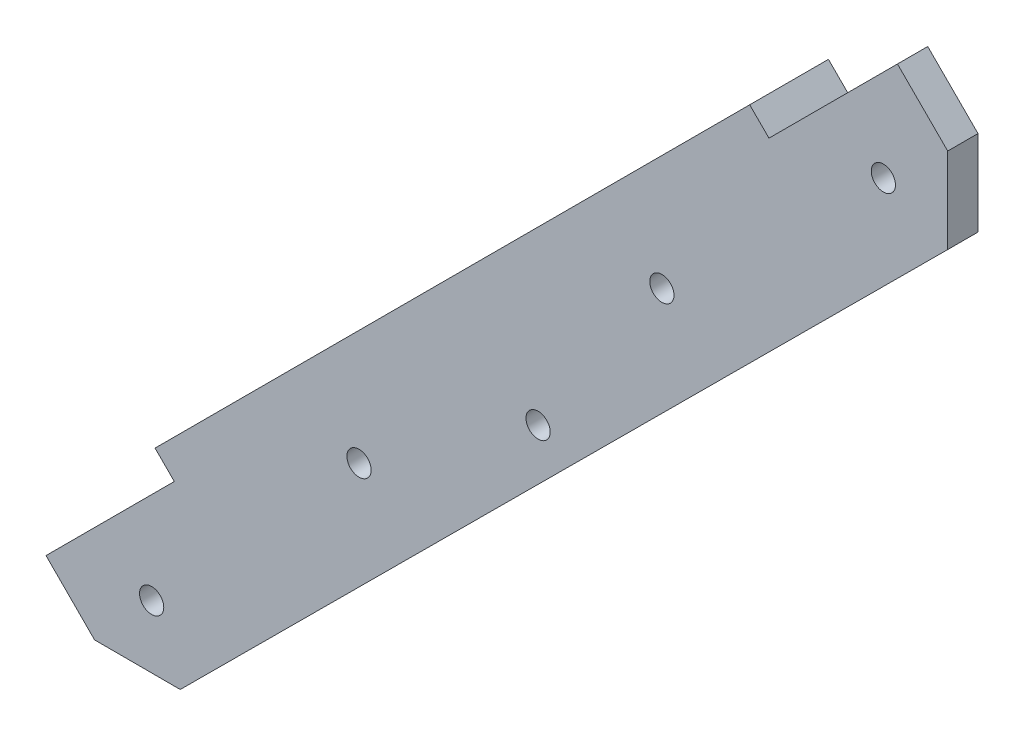
ISO-10303-21;
HEADER;
FILE_DESCRIPTION(('STEP AP214'),'2;1');
FILE_NAME('part.step','',(''),(''),'','','');
FILE_SCHEMA(('AUTOMOTIVE_DESIGN { 1 0 10303 214 1 1 1 1 }'));
ENDSEC;
DATA;
#1=APPLICATION_CONTEXT('core data for automotive mechanical design processes');
#2=APPLICATION_PROTOCOL_DEFINITION('international standard','automotive_design',2000,#1);
#3=PRODUCT_CONTEXT('',#1,'mechanical');
#4=PRODUCT('Part','Part','',(#3));
#5=PRODUCT_RELATED_PRODUCT_CATEGORY('part','',(#4));
#6=PRODUCT_DEFINITION_FORMATION('','',#4);
#7=PRODUCT_DEFINITION_CONTEXT('part definition',#1,'design');
#8=PRODUCT_DEFINITION('design','',#6,#7);
#9=PRODUCT_DEFINITION_SHAPE('','',#8);
#10=(LENGTH_UNIT() NAMED_UNIT(*) SI_UNIT(.MILLI.,.METRE.));
#11=(NAMED_UNIT(*) PLANE_ANGLE_UNIT() SI_UNIT($,.RADIAN.));
#12=(NAMED_UNIT(*) SI_UNIT($,.STERADIAN.) SOLID_ANGLE_UNIT());
#13=UNCERTAINTY_MEASURE_WITH_UNIT(LENGTH_MEASURE(1.E-05),#10,'distance_accuracy_value','');
#14=(GEOMETRIC_REPRESENTATION_CONTEXT(3) GLOBAL_UNCERTAINTY_ASSIGNED_CONTEXT((#13)) GLOBAL_UNIT_ASSIGNED_CONTEXT((#10,
#11,#12)) REPRESENTATION_CONTEXT('',''));
#15=CARTESIAN_POINT('',(0.,0.,0.));
#16=DIRECTION('',(0.,0.,1.));
#17=DIRECTION('',(1.,0.,0.));
#18=AXIS2_PLACEMENT_3D('',#15,#16,#17);
#19=CARTESIAN_POINT('',(111.999999999999,110.,-8.00100000000389));
#20=DIRECTION('',(0.,0.,1.));
#21=DIRECTION('',(1.,0.,0.));
#22=AXIS2_PLACEMENT_3D('',#19,#20,#21);
#23=CYLINDRICAL_SURFACE('',#22,1.99999999999992);
#24=CARTESIAN_POINT('',(111.999999999999,110.,5.));
#25=DIRECTION('',(0.,0.,1.));
#26=DIRECTION('',(1.,0.,0.));
#27=AXIS2_PLACEMENT_3D('',#24,#25,#26);
#28=CIRCLE('',#27,1.99999999999992);
#29=CARTESIAN_POINT('',(113.999999999999,110.,5.));
#30=VERTEX_POINT('',#29);
#31=EDGE_CURVE('E219',#30,#30,#28,.T.);
#32=ORIENTED_EDGE('',*,*,#31,.T.);
#33=EDGE_LOOP('',(#32));
#34=FACE_BOUND('',#33,.T.);
#35=CARTESIAN_POINT('',(111.999999999999,110.,-5.00000000000385));
#36=DIRECTION('',(0.,0.,-1.));
#37=DIRECTION('',(0.,1.,0.));
#38=AXIS2_PLACEMENT_3D('',#35,#36,#37);
#39=CIRCLE('',#38,1.99999999999992);
#40=CARTESIAN_POINT('',(111.999999999999,112.,-5.00000000000385));
#41=VERTEX_POINT('',#40);
#42=EDGE_CURVE('E222',#41,#41,#39,.F.);
#43=ORIENTED_EDGE('',*,*,#42,.F.);
#44=EDGE_LOOP('',(#43));
#45=FACE_BOUND('',#44,.T.);
#46=ADVANCED_FACE('F34',(#34,#45),#23,.F.);
#47=CARTESIAN_POINT('',(61.9999999999991,60.0000000000004,-8.00100000000389));
#48=DIRECTION('',(0.,0.,1.));
#49=DIRECTION('',(1.,0.,0.));
#50=AXIS2_PLACEMENT_3D('',#47,#48,#49);
#51=CYLINDRICAL_SURFACE('',#50,1.99999999999989);
#52=CARTESIAN_POINT('',(61.9999999999991,60.0000000000004,5.));
#53=DIRECTION('',(0.,0.,1.));
#54=DIRECTION('',(1.,0.,0.));
#55=AXIS2_PLACEMENT_3D('',#52,#53,#54);
#56=CIRCLE('',#55,1.99999999999989);
#57=CARTESIAN_POINT('',(63.999999999999,60.0000000000004,5.));
#58=VERTEX_POINT('',#57);
#59=EDGE_CURVE('E215',#58,#58,#56,.T.);
#60=ORIENTED_EDGE('',*,*,#59,.T.);
#61=EDGE_LOOP('',(#60));
#62=FACE_BOUND('',#61,.T.);
#63=CARTESIAN_POINT('',(61.9999999999991,60.0000000000004,-5.00000000000388));
#64=DIRECTION('',(0.,0.,-1.));
#65=DIRECTION('',(0.,1.,0.));
#66=AXIS2_PLACEMENT_3D('',#63,#64,#65);
#67=CIRCLE('',#66,1.99999999999989);
#68=CARTESIAN_POINT('',(61.9999999999991,62.0000000000003,-5.00000000000388));
#69=VERTEX_POINT('',#68);
#70=EDGE_CURVE('E206',#69,#69,#67,.F.);
#71=ORIENTED_EDGE('',*,*,#70,.F.);
#72=EDGE_LOOP('',(#71));
#73=FACE_BOUND('',#72,.T.);
#74=ADVANCED_FACE('F374',(#62,#73),#51,.F.);
#75=CARTESIAN_POINT('',(0.,0.,0.));
#76=DIRECTION('',(0.,0.,-1.));
#77=DIRECTION('',(-1.,0.,0.));
#78=AXIS2_PLACEMENT_3D('',#75,#76,#77);
#79=PLANE('',#78);
#80=DIRECTION('',(0.708378811392067,0.705832458569852,0.));
#81=VECTOR('',#80,1.);
#82=CARTESIAN_POINT('',(144.999999999996,125.000009715621,0.));
#83=LINE('',#82,#81);
#84=CARTESIAN_POINT('',(32.4788703815637,12.8833508286033,0.));
#85=VERTEX_POINT('',#84);
#86=CARTESIAN_POINT('',(46.6133955019609,26.9670676987364,0.));
#87=VERTEX_POINT('',#86);
#88=EDGE_CURVE('E280',#85,#87,#83,.T.);
#89=ORIENTED_EDGE('',*,*,#88,.F.);
#90=DIRECTION('',(0.999998379020512,-0.0018005433478821,0.));
#91=VECTOR('',#90,1.);
#92=CARTESIAN_POINT('',(0.023302289110957,12.9417885805603,0.));
#93=LINE('',#92,#91);
#94=CARTESIAN_POINT('',(18.3367576819445,12.9088143568254,0.));
#95=VERTEX_POINT('',#94);
#96=EDGE_CURVE('E58',#85,#95,#93,.F.);
#97=ORIENTED_EDGE('',*,*,#96,.T.);
#98=DIRECTION('',(0.705832458569853,-0.708378811392066,0.));
#99=VECTOR('',#98,1.);
#100=CARTESIAN_POINT('',(25.3950822676431,5.82502624290472,0.));
#101=LINE('',#100,#99);
#102=CARTESIAN_POINT('',(10.3192285063964,20.9552674757194,0.));
#103=VERTEX_POINT('',#102);
#104=EDGE_CURVE('E264',#103,#95,#101,.T.);
#105=ORIENTED_EDGE('',*,*,#104,.F.);
#106=DIRECTION('',(-0.707106781186551,-0.707106781186544,0.));
#107=VECTOR('',#106,1.);
#108=CARTESIAN_POINT('',(31.5052038200413,42.1412427893641,0.));
#109=LINE('',#108,#107);
#110=CARTESIAN_POINT('',(31.4994745169042,42.1355134862271,0.));
#111=VERTEX_POINT('',#110);
#112=EDGE_CURVE('E290',#111,#103,#109,.T.);
#113=ORIENTED_EDGE('',*,*,#112,.F.);
#114=DIRECTION('',(-0.705832458569853,0.708378811392066,0.));
#115=VECTOR('',#114,1.);
#116=CARTESIAN_POINT('',(28.3232233047018,45.3232233047036,0.));
#117=LINE('',#116,#115);
#118=EDGE_CURVE('E239',#87,#111,#117,.T.);
#119=ORIENTED_EDGE('',*,*,#118,.F.);
#120=EDGE_LOOP('',(#89,#97,#105,#113,#119));
#121=FACE_BOUND('',#120,.T.);
#122=CARTESIAN_POINT('',(27.7621167157391,23.2569128956978,0.));
#123=DIRECTION('',(0.,0.,-1.));
#124=DIRECTION('',(-1.,0.,0.));
#125=AXIS2_PLACEMENT_3D('',#122,#123,#124);
#126=CIRCLE('',#125,2.);
#127=CARTESIAN_POINT('',(25.7621167157391,23.2569128956978,0.));
#128=VERTEX_POINT('',#127);
#129=EDGE_CURVE('E311',#128,#128,#126,.T.);
#130=ORIENTED_EDGE('',*,*,#129,.F.);
#131=EDGE_LOOP('',(#130));
#132=FACE_BOUND('',#131,.T.);
#133=ADVANCED_FACE('F380',(#121,#132),#79,.T.);
#134=CARTESIAN_POINT('',(144.999999999996,125.000009715621,5.));
#135=DIRECTION('',(-0.705832458569852,0.708378811392067,0.));
#136=DIRECTION('',(-0.708378811392067,-0.705832458569852,0.));
#137=AXIS2_PLACEMENT_3D('',#134,#135,#136);
#138=PLANE('',#137);
#139=DIRECTION('',(0.708378811392067,0.705832458569853,0.));
#140=VECTOR('',#139,1.);
#141=CARTESIAN_POINT('',(46.6133955019609,26.9670676987363,-8.00000000000389));
#142=LINE('',#141,#140);
#143=CARTESIAN_POINT('',(46.6133955019609,26.9670676987363,-8.00000000000389));
#144=VERTEX_POINT('',#143);
#145=CARTESIAN_POINT('',(86.0012902722658,66.2133779447775,-8.00000000000387));
#146=VERTEX_POINT('',#145);
#147=EDGE_CURVE('E223',#144,#146,#142,.T.);
#148=ORIENTED_EDGE('',*,*,#147,.T.);
#149=DIRECTION('',(0.,0.,1.));
#150=VECTOR('',#149,1.);
#151=CARTESIAN_POINT('',(86.0012902722658,66.2133779447776,4.99999999999997));
#152=LINE('',#151,#150);
#153=CARTESIAN_POINT('',(86.0012902722658,66.2133779447775,-1.00000000000387));
#154=VERTEX_POINT('',#153);
#155=EDGE_CURVE('E199',#146,#154,#152,.T.);
#156=ORIENTED_EDGE('',*,*,#155,.T.);
#157=DIRECTION('',(-0.708378811392067,-0.705832458569852,0.));
#158=VECTOR('',#157,1.);
#159=CARTESIAN_POINT('',(144.999999999996,125.000009715621,-1.00000000000384));
#160=LINE('',#159,#158);
#161=CARTESIAN_POINT('',(105.612105229692,85.7536994695806,-1.00000000000386));
#162=VERTEX_POINT('',#161);
#163=EDGE_CURVE('E11',#162,#154,#160,.T.);
#164=ORIENTED_EDGE('',*,*,#163,.F.);
#165=DIRECTION('',(0.,0.,-1.));
#166=VECTOR('',#165,1.);
#167=CARTESIAN_POINT('',(105.612105229692,85.7536994695806,4.99999999999998));
#168=LINE('',#167,#166);
#169=CARTESIAN_POINT('',(105.612105229692,85.7536994695806,-8.00000000000386));
#170=VERTEX_POINT('',#169);
#171=EDGE_CURVE('E195',#162,#170,#168,.T.);
#172=ORIENTED_EDGE('',*,*,#171,.T.);
#173=CARTESIAN_POINT('',(144.999999999997,125.000009715622,-8.00000000000384));
#174=VERTEX_POINT('',#173);
#175=EDGE_CURVE('E227',#170,#174,#142,.T.);
#176=ORIENTED_EDGE('',*,*,#175,.T.);
#177=DIRECTION('',(0.,0.,1.));
#178=VECTOR('',#177,1.);
#179=CARTESIAN_POINT('',(144.999999999997,125.000009715622,-172.904201471418));
#180=LINE('',#179,#178);
#181=CARTESIAN_POINT('',(144.999999999997,125.000009715622,0.));
#182=VERTEX_POINT('',#181);
#183=EDGE_CURVE('E248',#174,#182,#180,.T.);
#184=ORIENTED_EDGE('',*,*,#183,.T.);
#185=CARTESIAN_POINT('',(159.167576227838,139.116658887018,0.));
#186=VERTEX_POINT('',#185);
#187=EDGE_CURVE('E283',#182,#186,#83,.T.);
#188=ORIENTED_EDGE('',*,*,#187,.T.);
#189=DIRECTION('',(0.,0.,1.));
#190=VECTOR('',#189,1.);
#191=CARTESIAN_POINT('',(159.167576227838,139.116658887018,5.));
#192=LINE('',#191,#190);
#193=CARTESIAN_POINT('',(159.167576227837,139.116658887018,5.));
#194=VERTEX_POINT('',#193);
#195=EDGE_CURVE('E321',#186,#194,#192,.T.);
#196=ORIENTED_EDGE('',*,*,#195,.T.);
#197=DIRECTION('',(0.708378811392066,0.705832458569853,0.));
#198=VECTOR('',#197,1.);
#199=CARTESIAN_POINT('',(46.6464466094051,27.0000000000003,5.));
#200=LINE('',#199,#198);
#201=CARTESIAN_POINT('',(32.4788703815637,12.8833508286032,5.));
#202=VERTEX_POINT('',#201);
#203=EDGE_CURVE('E260',#202,#194,#200,.T.);
#204=ORIENTED_EDGE('',*,*,#203,.F.);
#205=DIRECTION('',(0.,0.,-1.));
#206=VECTOR('',#205,1.);
#207=CARTESIAN_POINT('',(32.4788703815637,12.8833508286033,5.));
#208=LINE('',#207,#206);
#209=EDGE_CURVE('E318',#202,#85,#208,.T.);
#210=ORIENTED_EDGE('',*,*,#209,.T.);
#211=ORIENTED_EDGE('',*,*,#88,.T.);
#212=DIRECTION('',(0.,0.,1.));
#213=VECTOR('',#212,1.);
#214=CARTESIAN_POINT('',(46.6133955019609,26.9670676987363,-172.904201471418));
#215=LINE('',#214,#213);
#216=EDGE_CURVE('E245',#144,#87,#215,.T.);
#217=ORIENTED_EDGE('',*,*,#216,.F.);
#218=EDGE_LOOP('',(#148,#156,#164,#172,#176,#184,#188,#196,#204,#210,#211,#217));
#219=FACE_BOUND('',#218,.T.);
#220=ADVANCED_FACE('F339',(#219),#138,.F.);
#221=CARTESIAN_POINT('',(166.251364341758,146.174983472716,5.));
#222=DIRECTION('',(-0.707106781186548,-0.707106781186547,0.));
#223=DIRECTION('',(0.707106781186547,-0.707106781186548,0.));
#224=AXIS2_PLACEMENT_3D('',#221,#222,#223);
#225=PLANE('',#224);
#226=DIRECTION('',(-0.707106781186547,0.707106781186548,0.));
#227=VECTOR('',#226,1.);
#228=CARTESIAN_POINT('',(166.251364341758,146.174983472716,5.));
#229=LINE('',#228,#227);
#230=CARTESIAN_POINT('',(159.192993990203,153.233353824272,5.));
#231=VERTEX_POINT('',#230);
#232=CARTESIAN_POINT('',(150.895154422576,161.531193391899,5.));
#233=VERTEX_POINT('',#232);
#234=EDGE_CURVE('E263',#231,#233,#229,.T.);
#235=ORIENTED_EDGE('',*,*,#234,.F.);
#236=DIRECTION('',(0.,0.,-1.));
#237=VECTOR('',#236,1.);
#238=CARTESIAN_POINT('',(159.192993990203,153.233353824272,5.));
#239=LINE('',#238,#237);
#240=CARTESIAN_POINT('',(159.192993990203,153.233353824272,0.));
#241=VERTEX_POINT('',#240);
#242=EDGE_CURVE('E237',#231,#241,#239,.T.);
#243=ORIENTED_EDGE('',*,*,#242,.T.);
#244=DIRECTION('',(-0.707106781186547,0.707106781186548,0.));
#245=VECTOR('',#244,1.);
#246=CARTESIAN_POINT('',(166.251364341758,146.174983472716,0.));
#247=LINE('',#246,#245);
#248=CARTESIAN_POINT('',(150.895154422576,161.531193391899,0.));
#249=VERTEX_POINT('',#248);
#250=EDGE_CURVE('E282',#241,#249,#247,.T.);
#251=ORIENTED_EDGE('',*,*,#250,.T.);
#252=DIRECTION('',(0.,0.,-1.));
#253=VECTOR('',#252,1.);
#254=CARTESIAN_POINT('',(150.895154422576,161.531193391899,5.));
#255=LINE('',#254,#253);
#256=EDGE_CURVE('E238',#233,#249,#255,.T.);
#257=ORIENTED_EDGE('',*,*,#256,.F.);
#258=EDGE_LOOP('',(#235,#243,#251,#257));
#259=FACE_BOUND('',#258,.T.);
#260=ADVANCED_FACE('F431',(#259),#225,.F.);
#261=CARTESIAN_POINT('',(150.895154422576,161.531193391899,5.));
#262=DIRECTION('',(0.7071067811865,-0.707106781186595,0.));
#263=DIRECTION('',(0.707106781186595,0.7071067811865,0.));
#264=AXIS2_PLACEMENT_3D('',#261,#262,#263);
#265=PLANE('',#264);
#266=DIRECTION('',(-0.707106781186595,-0.7071067811865,0.));
#267=VECTOR('',#266,1.);
#268=CARTESIAN_POINT('',(150.895154422576,161.531193391899,0.));
#269=LINE('',#268,#267);
#270=CARTESIAN_POINT('',(129.681985373146,140.318024342472,0.));
#271=VERTEX_POINT('',#270);
#272=EDGE_CURVE('E285',#249,#271,#269,.T.);
#273=ORIENTED_EDGE('',*,*,#272,.T.);
#274=DIRECTION('',(0.,0.,-1.));
#275=VECTOR('',#274,1.);
#276=CARTESIAN_POINT('',(129.681985373146,140.318024342472,5.));
#277=LINE('',#276,#275);
#278=CARTESIAN_POINT('',(129.681985373146,140.318024342472,5.));
#279=VERTEX_POINT('',#278);
#280=EDGE_CURVE('E304',#279,#271,#277,.T.);
#281=ORIENTED_EDGE('',*,*,#280,.F.);
#282=DIRECTION('',(-0.707106781186595,-0.7071067811865,0.));
#283=VECTOR('',#282,1.);
#284=CARTESIAN_POINT('',(150.895154422576,161.531193391899,5.));
#285=LINE('',#284,#283);
#286=EDGE_CURVE('E266',#233,#279,#285,.T.);
#287=ORIENTED_EDGE('',*,*,#286,.F.);
#288=ORIENTED_EDGE('',*,*,#256,.T.);
#289=EDGE_LOOP('',(#273,#281,#287,#288));
#290=FACE_BOUND('',#289,.T.);
#291=ADVANCED_FACE('F428',(#290),#265,.F.);
#292=CARTESIAN_POINT('',(129.681985373146,140.318024342472,5.));
#293=DIRECTION('',(-0.707106781186588,-0.707106781186507,0.));
#294=DIRECTION('',(0.707106781186507,-0.707106781186588,0.));
#295=AXIS2_PLACEMENT_3D('',#292,#293,#294);
#296=PLANE('',#295);
#297=ORIENTED_EDGE('',*,*,#280,.T.);
#298=DIRECTION('',(0.707106781186548,-0.707106781186547,0.));
#299=VECTOR('',#298,1.);
#300=CARTESIAN_POINT('',(144.999999999997,125.000009715622,0.));
#301=LINE('',#300,#299);
#302=EDGE_CURVE('E234',#271,#182,#301,.T.);
#303=ORIENTED_EDGE('',*,*,#302,.T.);
#304=ORIENTED_EDGE('',*,*,#183,.F.);
#305=DIRECTION('',(-0.707106781186548,0.707106781186547,0.));
#306=VECTOR('',#305,1.);
#307=CARTESIAN_POINT('',(144.999999999997,125.000009715622,-8.00000000000384));
#308=LINE('',#307,#306);
#309=CARTESIAN_POINT('',(126.500004857807,143.500004857812,-8.00000000000384));
#310=VERTEX_POINT('',#309);
#311=EDGE_CURVE('E226',#174,#310,#308,.T.);
#312=ORIENTED_EDGE('',*,*,#311,.T.);
#313=DIRECTION('',(0.,0.,-1.));
#314=VECTOR('',#313,1.);
#315=CARTESIAN_POINT('',(126.500004857807,143.500004857812,5.));
#316=LINE('',#315,#314);
#317=CARTESIAN_POINT('',(126.500004857807,143.500004857812,5.));
#318=VERTEX_POINT('',#317);
#319=EDGE_CURVE('E302',#318,#310,#316,.T.);
#320=ORIENTED_EDGE('',*,*,#319,.F.);
#321=DIRECTION('',(-0.707106781186507,0.707106781186588,0.));
#322=VECTOR('',#321,1.);
#323=CARTESIAN_POINT('',(129.681985373146,140.318024342472,5.));
#324=LINE('',#323,#322);
#325=EDGE_CURVE('E268',#279,#318,#324,.T.);
#326=ORIENTED_EDGE('',*,*,#325,.F.);
#327=EDGE_LOOP('',(#297,#303,#304,#312,#320,#326));
#328=FACE_BOUND('',#327,.T.);
#329=ADVANCED_FACE('F355',(#328),#296,.F.);
#330=CARTESIAN_POINT('',(126.500004857807,143.500004857812,5.));
#331=DIRECTION('',(0.707106781186559,-0.707106781186536,0.));
#332=DIRECTION('',(0.707106781186536,0.707106781186559,0.));
#333=AXIS2_PLACEMENT_3D('',#330,#331,#332);
#334=PLANE('',#333);
#335=ORIENTED_EDGE('',*,*,#319,.T.);
#336=DIRECTION('',(-0.707106781186536,-0.707106781186559,0.));
#337=VECTOR('',#336,1.);
#338=CARTESIAN_POINT('',(126.500004857807,143.500004857812,-8.00000000000384));
#339=LINE('',#338,#337);
#340=CARTESIAN_POINT('',(28.3232233047018,45.3232233047036,-8.00000000000389));
#341=VERTEX_POINT('',#340);
#342=EDGE_CURVE('E230',#310,#341,#339,.T.);
#343=ORIENTED_EDGE('',*,*,#342,.T.);
#344=DIRECTION('',(0.,0.,1.));
#345=VECTOR('',#344,1.);
#346=CARTESIAN_POINT('',(28.3232233047018,45.3232233047036,-172.904201471418));
#347=LINE('',#346,#345);
#348=CARTESIAN_POINT('',(28.3232233047018,45.3232233047036,0.));
#349=VERTEX_POINT('',#348);
#350=EDGE_CURVE('E242',#341,#349,#347,.T.);
#351=ORIENTED_EDGE('',*,*,#350,.T.);
#352=DIRECTION('',(0.,0.,-1.));
#353=VECTOR('',#352,1.);
#354=CARTESIAN_POINT('',(28.3232233047018,45.3232233047036,5.));
#355=LINE('',#354,#353);
#356=CARTESIAN_POINT('',(28.3232233047018,45.3232233047036,5.));
#357=VERTEX_POINT('',#356);
#358=EDGE_CURVE('E300',#357,#349,#355,.T.);
#359=ORIENTED_EDGE('',*,*,#358,.F.);
#360=DIRECTION('',(-0.707106781186536,-0.707106781186559,0.));
#361=VECTOR('',#360,1.);
#362=CARTESIAN_POINT('',(126.500004857807,143.500004857812,5.));
#363=LINE('',#362,#361);
#364=EDGE_CURVE('E270',#318,#357,#363,.T.);
#365=ORIENTED_EDGE('',*,*,#364,.F.);
#366=EDGE_LOOP('',(#335,#343,#351,#359,#365));
#367=FACE_BOUND('',#366,.T.);
#368=ADVANCED_FACE('F349',(#367),#334,.F.);
#369=CARTESIAN_POINT('',(28.3232233047018,45.3232233047036,5.));
#370=DIRECTION('',(0.707106781186548,0.707106781186547,0.));
#371=DIRECTION('',(-0.707106781186547,0.707106781186548,0.));
#372=AXIS2_PLACEMENT_3D('',#369,#370,#371);
#373=PLANE('',#372);
#374=DIRECTION('',(0.707106781186547,-0.707106781186548,0.));
#375=VECTOR('',#374,1.);
#376=CARTESIAN_POINT('',(28.3232233047018,45.3232233047036,0.));
#377=LINE('',#376,#375);
#378=CARTESIAN_POINT('',(31.5052038200413,42.1412427893641,0.));
#379=VERTEX_POINT('',#378);
#380=EDGE_CURVE('E288',#349,#379,#377,.T.);
#381=ORIENTED_EDGE('',*,*,#380,.T.);
#382=DIRECTION('',(0.,0.,-1.));
#383=VECTOR('',#382,1.);
#384=CARTESIAN_POINT('',(31.5052038200413,42.1412427893641,5.));
#385=LINE('',#384,#383);
#386=CARTESIAN_POINT('',(31.5052038200413,42.1412427893641,5.));
#387=VERTEX_POINT('',#386);
#388=EDGE_CURVE('E297',#387,#379,#385,.T.);
#389=ORIENTED_EDGE('',*,*,#388,.F.);
#390=DIRECTION('',(0.707106781186547,-0.707106781186548,0.));
#391=VECTOR('',#390,1.);
#392=CARTESIAN_POINT('',(28.3232233047018,45.3232233047036,5.));
#393=LINE('',#392,#391);
#394=EDGE_CURVE('E272',#357,#387,#393,.T.);
#395=ORIENTED_EDGE('',*,*,#394,.F.);
#396=ORIENTED_EDGE('',*,*,#358,.T.);
#397=EDGE_LOOP('',(#381,#389,#395,#396));
#398=FACE_BOUND('',#397,.T.);
#399=ADVANCED_FACE('F419',(#398),#373,.F.);
#400=CARTESIAN_POINT('',(31.5052038200413,42.1412427893641,5.));
#401=DIRECTION('',(0.707106781186544,-0.707106781186551,0.));
#402=DIRECTION('',(0.707106781186551,0.707106781186544,0.));
#403=AXIS2_PLACEMENT_3D('',#400,#401,#402);
#404=PLANE('',#403);
#405=EDGE_CURVE('E291',#379,#111,#109,.T.);
#406=ORIENTED_EDGE('',*,*,#405,.T.);
#407=ORIENTED_EDGE('',*,*,#112,.T.);
#408=DIRECTION('',(0.,0.,-1.));
#409=VECTOR('',#408,1.);
#410=CARTESIAN_POINT('',(10.3192285063964,20.9552674757194,5.));
#411=LINE('',#410,#409);
#412=CARTESIAN_POINT('',(10.3192285063964,20.9552674757194,5.));
#413=VERTEX_POINT('',#412);
#414=EDGE_CURVE('E279',#413,#103,#411,.T.);
#415=ORIENTED_EDGE('',*,*,#414,.F.);
#416=DIRECTION('',(-0.707106781186551,-0.707106781186544,0.));
#417=VECTOR('',#416,1.);
#418=CARTESIAN_POINT('',(31.5052038200413,42.1412427893641,5.));
#419=LINE('',#418,#417);
#420=EDGE_CURVE('E274',#387,#413,#419,.T.);
#421=ORIENTED_EDGE('',*,*,#420,.F.);
#422=ORIENTED_EDGE('',*,*,#388,.T.);
#423=EDGE_LOOP('',(#406,#407,#415,#421,#422));
#424=FACE_BOUND('',#423,.T.);
#425=ADVANCED_FACE('F415',(#424),#404,.F.);
#426=CARTESIAN_POINT('',(25.3950822676431,5.82502624290472,5.));
#427=DIRECTION('',(0.708378811392066,0.705832458569853,0.));
#428=DIRECTION('',(-0.705832458569853,0.708378811392066,0.));
#429=AXIS2_PLACEMENT_3D('',#426,#427,#428);
#430=PLANE('',#429);
#431=ORIENTED_EDGE('',*,*,#104,.T.);
#432=DIRECTION('',(0.,0.,1.));
#433=VECTOR('',#432,1.);
#434=CARTESIAN_POINT('',(18.3367576819445,12.9088143568254,5.));
#435=LINE('',#434,#433);
#436=CARTESIAN_POINT('',(18.3367576819445,12.9088143568254,5.));
#437=VERTEX_POINT('',#436);
#438=EDGE_CURVE('E328',#95,#437,#435,.T.);
#439=ORIENTED_EDGE('',*,*,#438,.T.);
#440=DIRECTION('',(0.705832458569853,-0.708378811392066,0.));
#441=VECTOR('',#440,1.);
#442=CARTESIAN_POINT('',(25.3950822676431,5.82502624290472,5.));
#443=LINE('',#442,#441);
#444=EDGE_CURVE('E276',#413,#437,#443,.T.);
#445=ORIENTED_EDGE('',*,*,#444,.F.);
#446=ORIENTED_EDGE('',*,*,#414,.T.);
#447=EDGE_LOOP('',(#431,#439,#445,#446));
#448=FACE_BOUND('',#447,.T.);
#449=ADVANCED_FACE('F408',(#448),#430,.F.);
#450=CARTESIAN_POINT('',(0.,0.,5.));
#451=DIRECTION('',(0.,0.,-1.));
#452=DIRECTION('',(-1.,0.,0.));
#453=AXIS2_PLACEMENT_3D('',#450,#451,#452);
#454=PLANE('',#453);
#455=CARTESIAN_POINT('',(91.5640570638597,80.2261793942983,5.));
#456=DIRECTION('',(0.,0.,-1.));
#457=DIRECTION('',(-1.,0.,0.));
#458=AXIS2_PLACEMENT_3D('',#455,#456,#457);
#459=CIRCLE('',#458,2.00000000000003);
#460=CARTESIAN_POINT('',(89.5640570638597,80.2261793942983,5.));
#461=VERTEX_POINT('',#460);
#462=EDGE_CURVE('E186',#461,#461,#459,.T.);
#463=ORIENTED_EDGE('',*,*,#462,.T.);
#464=EDGE_LOOP('',(#463));
#465=FACE_BOUND('',#464,.T.);
#466=ORIENTED_EDGE('',*,*,#59,.F.);
#467=EDGE_LOOP('',(#466));
#468=FACE_BOUND('',#467,.T.);
#469=ORIENTED_EDGE('',*,*,#31,.F.);
#470=EDGE_LOOP('',(#469));
#471=FACE_BOUND('',#470,.T.);
#472=CARTESIAN_POINT('',(27.7621167157391,23.2569128956978,5.));
#473=DIRECTION('',(0.,0.,1.));
#474=DIRECTION('',(1.,0.,0.));
#475=AXIS2_PLACEMENT_3D('',#472,#473,#474);
#476=CIRCLE('',#475,2.);
#477=CARTESIAN_POINT('',(29.7621167157391,23.2569128956978,5.));
#478=VERTEX_POINT('',#477);
#479=EDGE_CURVE('E254',#478,#478,#476,.T.);
#480=ORIENTED_EDGE('',*,*,#479,.F.);
#481=EDGE_LOOP('',(#480));
#482=FACE_BOUND('',#481,.T.);
#483=CARTESIAN_POINT('',(148.566315266813,144.061111446774,5.));
#484=DIRECTION('',(0.,0.,1.));
#485=DIRECTION('',(1.,0.,0.));
#486=AXIS2_PLACEMENT_3D('',#483,#484,#485);
#487=CIRCLE('',#486,2.);
#488=CARTESIAN_POINT('',(150.566315266813,144.061111446774,5.));
#489=VERTEX_POINT('',#488);
#490=EDGE_CURVE('E233',#489,#489,#487,.T.);
#491=ORIENTED_EDGE('',*,*,#490,.F.);
#492=EDGE_LOOP('',(#491));
#493=FACE_BOUND('',#492,.T.);
#494=ORIENTED_EDGE('',*,*,#203,.T.);
#495=DIRECTION('',(-0.00180054334788453,-0.999998379020513,0.));
#496=VECTOR('',#495,1.);
#497=CARTESIAN_POINT('',(159.192993990203,153.233353824272,5.));
#498=LINE('',#497,#496);
#499=EDGE_CURVE('E325',#194,#231,#498,.F.);
#500=ORIENTED_EDGE('',*,*,#499,.T.);
#501=ORIENTED_EDGE('',*,*,#234,.T.);
#502=ORIENTED_EDGE('',*,*,#286,.T.);
#503=ORIENTED_EDGE('',*,*,#325,.T.);
#504=ORIENTED_EDGE('',*,*,#364,.T.);
#505=ORIENTED_EDGE('',*,*,#394,.T.);
#506=ORIENTED_EDGE('',*,*,#420,.T.);
#507=ORIENTED_EDGE('',*,*,#444,.T.);
#508=DIRECTION('',(-0.999998379020512,0.0018005433478821,0.));
#509=VECTOR('',#508,1.);
#510=CARTESIAN_POINT('',(32.4788703815637,12.8833508286033,5.));
#511=LINE('',#510,#509);
#512=EDGE_CURVE('E323',#437,#202,#511,.F.);
#513=ORIENTED_EDGE('',*,*,#512,.T.);
#514=EDGE_LOOP('',(#494,#500,#501,#502,#503,#504,#505,#506,#507,#513));
#515=FACE_BOUND('',#514,.T.);
#516=ADVANCED_FACE('F405',(#465,#468,#471,#482,#493,#515),#454,.F.);
#517=ORIENTED_EDGE('',*,*,#250,.F.);
#518=DIRECTION('',(0.00180054334788453,0.999998379020513,0.));
#519=VECTOR('',#518,1.);
#520=CARTESIAN_POINT('',(158.916575044796,-0.286136645887134,0.));
#521=LINE('',#520,#519);
#522=EDGE_CURVE('E316',#241,#186,#521,.F.);
#523=ORIENTED_EDGE('',*,*,#522,.T.);
#524=ORIENTED_EDGE('',*,*,#187,.F.);
#525=ORIENTED_EDGE('',*,*,#302,.F.);
#526=ORIENTED_EDGE('',*,*,#272,.F.);
#527=EDGE_LOOP('',(#517,#523,#524,#525,#526));
#528=FACE_BOUND('',#527,.T.);
#529=CARTESIAN_POINT('',(148.566315266813,144.061111446774,0.));
#530=DIRECTION('',(0.,0.,-1.));
#531=DIRECTION('',(-1.,0.,0.));
#532=AXIS2_PLACEMENT_3D('',#529,#530,#531);
#533=CIRCLE('',#532,2.);
#534=CARTESIAN_POINT('',(146.566315266813,144.061111446774,0.));
#535=VERTEX_POINT('',#534);
#536=EDGE_CURVE('E257',#535,#535,#533,.T.);
#537=ORIENTED_EDGE('',*,*,#536,.F.);
#538=EDGE_LOOP('',(#537));
#539=FACE_BOUND('',#538,.T.);
#540=ADVANCED_FACE('F403',(#528,#539),#79,.T.);
#541=CARTESIAN_POINT('',(148.566315266813,144.061111446774,-10.));
#542=DIRECTION('',(0.,0.,1.));
#543=DIRECTION('',(1.,0.,0.));
#544=AXIS2_PLACEMENT_3D('',#541,#542,#543);
#545=CYLINDRICAL_SURFACE('',#544,2.);
#546=ORIENTED_EDGE('',*,*,#536,.T.);
#547=EDGE_LOOP('',(#546));
#548=FACE_BOUND('',#547,.T.);
#549=ORIENTED_EDGE('',*,*,#490,.T.);
#550=EDGE_LOOP('',(#549));
#551=FACE_BOUND('',#550,.T.);
#552=ADVANCED_FACE('F399',(#548,#551),#545,.F.);
#553=CARTESIAN_POINT('',(27.7621167157391,23.2569128956978,-10.));
#554=DIRECTION('',(0.,0.,1.));
#555=DIRECTION('',(1.,0.,0.));
#556=AXIS2_PLACEMENT_3D('',#553,#554,#555);
#557=CYLINDRICAL_SURFACE('',#556,2.);
#558=ORIENTED_EDGE('',*,*,#129,.T.);
#559=EDGE_LOOP('',(#558));
#560=FACE_BOUND('',#559,.T.);
#561=ORIENTED_EDGE('',*,*,#479,.T.);
#562=EDGE_LOOP('',(#561));
#563=FACE_BOUND('',#562,.T.);
#564=ADVANCED_FACE('F393',(#560,#563),#557,.F.);
#565=CARTESIAN_POINT('',(0.,0.,0.));
#566=DIRECTION('',(0.,0.,-1.));
#567=DIRECTION('',(-1.,0.,0.));
#568=AXIS2_PLACEMENT_3D('',#565,#566,#567);
#569=PLANE('',#568);
#570=ORIENTED_EDGE('',*,*,#405,.F.);
#571=ORIENTED_EDGE('',*,*,#380,.F.);
#572=EDGE_CURVE('E218',#111,#349,#117,.T.);
#573=ORIENTED_EDGE('',*,*,#572,.F.);
#574=EDGE_LOOP('',(#570,#571,#573));
#575=FACE_BOUND('',#574,.T.);
#576=ADVANCED_FACE('F390',(#575),#569,.F.);
#577=CARTESIAN_POINT('',(28.3232233047018,45.3232233047036,-172.904201471418));
#578=DIRECTION('',(0.708378811392067,0.705832458569853,0.));
#579=DIRECTION('',(-0.705832458569853,0.708378811392067,0.));
#580=AXIS2_PLACEMENT_3D('',#577,#578,#579);
#581=PLANE('',#580);
#582=ORIENTED_EDGE('',*,*,#350,.F.);
#583=DIRECTION('',(0.705832458569853,-0.708378811392067,0.));
#584=VECTOR('',#583,1.);
#585=CARTESIAN_POINT('',(28.3232233047018,45.3232233047036,-8.00000000000389));
#586=LINE('',#585,#584);
#587=EDGE_CURVE('E251',#341,#144,#586,.T.);
#588=ORIENTED_EDGE('',*,*,#587,.T.);
#589=ORIENTED_EDGE('',*,*,#216,.T.);
#590=ORIENTED_EDGE('',*,*,#118,.T.);
#591=ORIENTED_EDGE('',*,*,#572,.T.);
#592=EDGE_LOOP('',(#582,#588,#589,#590,#591));
#593=FACE_BOUND('',#592,.T.);
#594=ADVANCED_FACE('F344',(#593),#581,.F.);
#595=CARTESIAN_POINT('',(171.999999999999,2.68739913555306,-8.00000000000387));
#596=DIRECTION('',(0.,0.,1.));
#597=DIRECTION('',(0.,1.,0.));
#598=AXIS2_PLACEMENT_3D('',#595,#596,#597);
#599=PLANE('',#598);
#600=CARTESIAN_POINT('',(61.9999999999991,60.0000000000004,-8.00000000000388));
#601=DIRECTION('',(0.,0.,-1.));
#602=DIRECTION('',(0.,1.,0.));
#603=AXIS2_PLACEMENT_3D('',#600,#601,#602);
#604=CIRCLE('',#603,4.00000000000013);
#605=CARTESIAN_POINT('',(61.9999999999991,64.0000000000005,-8.00000000000388));
#606=VERTEX_POINT('',#605);
#607=EDGE_CURVE('E207',#606,#606,#604,.T.);
#608=ORIENTED_EDGE('',*,*,#607,.F.);
#609=EDGE_LOOP('',(#608));
#610=FACE_BOUND('',#609,.T.);
#611=CARTESIAN_POINT('',(111.999999999999,110.,-8.00000000000385));
#612=DIRECTION('',(0.,0.,-1.));
#613=DIRECTION('',(0.,1.,0.));
#614=AXIS2_PLACEMENT_3D('',#611,#612,#613);
#615=CIRCLE('',#614,4.00000000000013);
#616=CARTESIAN_POINT('',(111.999999999999,114.,-8.00000000000385));
#617=VERTEX_POINT('',#616);
#618=EDGE_CURVE('E202',#617,#617,#615,.T.);
#619=ORIENTED_EDGE('',*,*,#618,.F.);
#620=EDGE_LOOP('',(#619));
#621=FACE_BOUND('',#620,.T.);
#622=DIRECTION('',(0.707106781186547,0.707106781186547,0.));
#623=VECTOR('',#622,1.);
#624=CARTESIAN_POINT('',(82.4224368911741,79.5698405958513,-8.00000000000387));
#625=LINE('',#624,#623);
#626=CARTESIAN_POINT('',(82.4224368911741,79.5698405958513,-8.00000000000387));
#627=VERTEX_POINT('',#626);
#628=CARTESIAN_POINT('',(92.2203958623068,89.367799566984,-8.00000000000386));
#629=VERTEX_POINT('',#628);
#630=EDGE_CURVE('E50',#627,#629,#625,.T.);
#631=ORIENTED_EDGE('',*,*,#630,.F.);
#632=DIRECTION('',(0.25881904510252,-0.965925826289068,0.));
#633=VECTOR('',#632,1.);
#634=CARTESIAN_POINT('',(107.643606179988,-14.5568446162981,-8.00000000000388));
#635=LINE('',#634,#633);
#636=EDGE_CURVE('E43',#627,#146,#635,.T.);
#637=ORIENTED_EDGE('',*,*,#636,.T.);
#638=ORIENTED_EDGE('',*,*,#147,.F.);
#639=ORIENTED_EDGE('',*,*,#587,.F.);
#640=ORIENTED_EDGE('',*,*,#342,.F.);
#641=ORIENTED_EDGE('',*,*,#311,.F.);
#642=ORIENTED_EDGE('',*,*,#175,.F.);
#643=DIRECTION('',(0.258819045102521,-0.965925826289068,0.));
#644=VECTOR('',#643,1.);
#645=CARTESIAN_POINT('',(105.604656722112,85.7814976783118,-8.00000000000386));
#646=LINE('',#645,#644);
#647=CARTESIAN_POINT('',(105.604656722112,85.7814976783118,-8.00000000000386));
#648=VERTEX_POINT('',#647);
#649=EDGE_CURVE('E181',#648,#170,#646,.T.);
#650=ORIENTED_EDGE('',*,*,#649,.F.);
#651=DIRECTION('',(0.965925826289068,-0.258819045102521,0.));
#652=VECTOR('',#651,1.);
#653=CARTESIAN_POINT('',(92.2203958623068,89.367799566984,-8.00000000000386));
#654=LINE('',#653,#652);
#655=EDGE_CURVE('E183',#629,#648,#654,.T.);
#656=ORIENTED_EDGE('',*,*,#655,.F.);
#657=EDGE_LOOP('',(#631,#637,#638,#639,#640,#641,#642,#650,#656));
#658=FACE_BOUND('',#657,.T.);
#659=ADVANCED_FACE('F335',(#610,#621,#658),#599,.F.);
#660=CARTESIAN_POINT('',(159.192993990203,153.233353824272,5.));
#661=DIRECTION('',(-0.999998379020512,0.00180054334788453,0.));
#662=DIRECTION('',(0.,0.,-1.));
#663=AXIS2_PLACEMENT_3D('',#660,#661,#662);
#664=PLANE('',#663);
#665=ORIENTED_EDGE('',*,*,#499,.F.);
#666=ORIENTED_EDGE('',*,*,#195,.F.);
#667=ORIENTED_EDGE('',*,*,#522,.F.);
#668=ORIENTED_EDGE('',*,*,#242,.F.);
#669=EDGE_LOOP('',(#665,#666,#667,#668));
#670=FACE_BOUND('',#669,.T.);
#671=ADVANCED_FACE('F388',(#670),#664,.F.);
#672=CARTESIAN_POINT('',(32.4788703815637,12.8833508286033,5.));
#673=DIRECTION('',(0.0018005433478821,0.999998379020512,0.));
#674=DIRECTION('',(0.,0.,-1.));
#675=AXIS2_PLACEMENT_3D('',#672,#673,#674);
#676=PLANE('',#675);
#677=ORIENTED_EDGE('',*,*,#512,.F.);
#678=ORIENTED_EDGE('',*,*,#438,.F.);
#679=ORIENTED_EDGE('',*,*,#96,.F.);
#680=ORIENTED_EDGE('',*,*,#209,.F.);
#681=EDGE_LOOP('',(#677,#678,#679,#680));
#682=FACE_BOUND('',#681,.T.);
#683=ADVANCED_FACE('F37',(#682),#676,.F.);
#684=CARTESIAN_POINT('',(61.9999999999991,60.0000000000004,-5.00000000000388));
#685=DIRECTION('',(0.,0.,-1.));
#686=DIRECTION('',(0.,1.,0.));
#687=AXIS2_PLACEMENT_3D('',#684,#685,#686);
#688=PLANE('',#687);
#689=CARTESIAN_POINT('',(61.9999999999991,60.0000000000004,-5.00000000000388));
#690=DIRECTION('',(0.,0.,-1.));
#691=DIRECTION('',(0.,1.,0.));
#692=AXIS2_PLACEMENT_3D('',#689,#690,#691);
#693=CIRCLE('',#692,4.00000000000013);
#694=CARTESIAN_POINT('',(61.9999999999991,64.0000000000005,-5.00000000000388));
#695=VERTEX_POINT('',#694);
#696=EDGE_CURVE('E203',#695,#695,#693,.T.);
#697=ORIENTED_EDGE('',*,*,#696,.T.);
#698=EDGE_LOOP('',(#697));
#699=FACE_BOUND('',#698,.T.);
#700=ORIENTED_EDGE('',*,*,#70,.T.);
#701=EDGE_LOOP('',(#700));
#702=FACE_BOUND('',#701,.T.);
#703=ADVANCED_FACE('F445',(#699,#702),#688,.T.);
#704=CARTESIAN_POINT('',(61.9999999999991,60.0000000000004,-5.00000000000388));
#705=DIRECTION('',(0.,0.,-1.));
#706=DIRECTION('',(0.,1.,0.));
#707=AXIS2_PLACEMENT_3D('',#704,#705,#706);
#708=CYLINDRICAL_SURFACE('',#707,4.00000000000013);
#709=ORIENTED_EDGE('',*,*,#696,.F.);
#710=EDGE_LOOP('',(#709));
#711=FACE_BOUND('',#710,.T.);
#712=ORIENTED_EDGE('',*,*,#607,.T.);
#713=EDGE_LOOP('',(#712));
#714=FACE_BOUND('',#713,.T.);
#715=ADVANCED_FACE('F600',(#711,#714),#708,.F.);
#716=CARTESIAN_POINT('',(111.999999999999,110.,-5.00000000000385));
#717=DIRECTION('',(0.,0.,-1.));
#718=DIRECTION('',(0.,1.,0.));
#719=AXIS2_PLACEMENT_3D('',#716,#717,#718);
#720=PLANE('',#719);
#721=CARTESIAN_POINT('',(111.999999999999,110.,-5.00000000000385));
#722=DIRECTION('',(0.,0.,-1.));
#723=DIRECTION('',(0.,1.,0.));
#724=AXIS2_PLACEMENT_3D('',#721,#722,#723);
#725=CIRCLE('',#724,4.00000000000013);
#726=CARTESIAN_POINT('',(111.999999999999,114.,-5.00000000000385));
#727=VERTEX_POINT('',#726);
#728=EDGE_CURVE('E210',#727,#727,#725,.T.);
#729=ORIENTED_EDGE('',*,*,#728,.T.);
#730=EDGE_LOOP('',(#729));
#731=FACE_BOUND('',#730,.T.);
#732=ORIENTED_EDGE('',*,*,#42,.T.);
#733=EDGE_LOOP('',(#732));
#734=FACE_BOUND('',#733,.T.);
#735=ADVANCED_FACE('F594',(#731,#734),#720,.T.);
#736=CARTESIAN_POINT('',(111.999999999999,110.,-5.00000000000385));
#737=DIRECTION('',(0.,0.,-1.));
#738=DIRECTION('',(0.,1.,0.));
#739=AXIS2_PLACEMENT_3D('',#736,#737,#738);
#740=CYLINDRICAL_SURFACE('',#739,4.00000000000013);
#741=ORIENTED_EDGE('',*,*,#728,.F.);
#742=EDGE_LOOP('',(#741));
#743=FACE_BOUND('',#742,.T.);
#744=ORIENTED_EDGE('',*,*,#618,.T.);
#745=EDGE_LOOP('',(#744));
#746=FACE_BOUND('',#745,.T.);
#747=ADVANCED_FACE('F370',(#743,#746),#740,.F.);
#748=CARTESIAN_POINT('',(0.,0.,-1.00000000000391));
#749=DIRECTION('',(0.,0.,-1.));
#750=DIRECTION('',(0.,1.,0.));
#751=AXIS2_PLACEMENT_3D('',#748,#749,#750);
#752=PLANE('',#751);
#753=CARTESIAN_POINT('',(91.5640570638597,80.2261793942983,-1.00000000000386));
#754=DIRECTION('',(0.,0.,-1.));
#755=DIRECTION('',(0.,1.,0.));
#756=AXIS2_PLACEMENT_3D('',#753,#754,#755);
#757=CIRCLE('',#756,2.00000000000003);
#758=CARTESIAN_POINT('',(91.5640570638597,82.2261793942984,-1.00000000000386));
#759=VERTEX_POINT('',#758);
#760=EDGE_CURVE('E658',#759,#759,#757,.T.);
#761=ORIENTED_EDGE('',*,*,#760,.F.);
#762=EDGE_LOOP('',(#761));
#763=FACE_BOUND('',#762,.T.);
#764=ORIENTED_EDGE('',*,*,#163,.T.);
#765=DIRECTION('',(-0.258819045102521,0.965925826289068,0.));
#766=VECTOR('',#765,1.);
#767=CARTESIAN_POINT('',(86.0087387798463,66.1855797360463,-1.00000000000387));
#768=LINE('',#767,#766);
#769=CARTESIAN_POINT('',(82.4224368911741,79.5698405958513,-1.00000000000387));
#770=VERTEX_POINT('',#769);
#771=EDGE_CURVE('E168',#154,#770,#768,.T.);
#772=ORIENTED_EDGE('',*,*,#771,.T.);
#773=DIRECTION('',(0.707106781186547,0.707106781186547,0.));
#774=VECTOR('',#773,1.);
#775=CARTESIAN_POINT('',(82.4224368911741,79.5698405958513,-1.00000000000387));
#776=LINE('',#775,#774);
#777=CARTESIAN_POINT('',(92.2203958623068,89.367799566984,-1.00000000000386));
#778=VERTEX_POINT('',#777);
#779=EDGE_CURVE('E163',#770,#778,#776,.T.);
#780=ORIENTED_EDGE('',*,*,#779,.T.);
#781=DIRECTION('',(0.965925826289068,-0.258819045102521,0.));
#782=VECTOR('',#781,1.);
#783=CARTESIAN_POINT('',(92.2203958623068,89.367799566984,-1.00000000000386));
#784=LINE('',#783,#782);
#785=CARTESIAN_POINT('',(105.604656722112,85.7814976783118,-1.00000000000386));
#786=VERTEX_POINT('',#785);
#787=EDGE_CURVE('E171',#778,#786,#784,.T.);
#788=ORIENTED_EDGE('',*,*,#787,.T.);
#789=DIRECTION('',(0.258819045102521,-0.965925826289068,0.));
#790=VECTOR('',#789,1.);
#791=CARTESIAN_POINT('',(105.604656722112,85.7814976783118,-1.00000000000386));
#792=LINE('',#791,#790);
#793=EDGE_CURVE('E176',#786,#162,#792,.T.);
#794=ORIENTED_EDGE('',*,*,#793,.T.);
#795=EDGE_LOOP('',(#764,#772,#780,#788,#794));
#796=FACE_BOUND('',#795,.T.);
#797=ADVANCED_FACE('F178',(#763,#796),#752,.T.);
#798=CARTESIAN_POINT('',(86.0087387798463,66.1855797360463,-1.00000000000387));
#799=DIRECTION('',(-0.965925826289069,-0.258819045102521,0.));
#800=DIRECTION('',(0.25881904510252,-0.965925826289068,0.));
#801=AXIS2_PLACEMENT_3D('',#798,#799,#800);
#802=PLANE('',#801);
#803=ORIENTED_EDGE('',*,*,#636,.F.);
#804=DIRECTION('',(0.,0.,-1.));
#805=VECTOR('',#804,1.);
#806=CARTESIAN_POINT('',(82.4224368911741,79.5698405958513,-1.00000000000387));
#807=LINE('',#806,#805);
#808=EDGE_CURVE('E193',#770,#627,#807,.T.);
#809=ORIENTED_EDGE('',*,*,#808,.F.);
#810=ORIENTED_EDGE('',*,*,#771,.F.);
#811=ORIENTED_EDGE('',*,*,#155,.F.);
#812=EDGE_LOOP('',(#803,#809,#810,#811));
#813=FACE_BOUND('',#812,.T.);
#814=ADVANCED_FACE('F362',(#813),#802,.F.);
#815=CARTESIAN_POINT('',(105.604656722112,85.7814976783118,-1.00000000000386));
#816=DIRECTION('',(0.965925826289068,0.258819045102521,0.));
#817=DIRECTION('',(-0.258819045102521,0.965925826289068,0.));
#818=AXIS2_PLACEMENT_3D('',#815,#816,#817);
#819=PLANE('',#818);
#820=ORIENTED_EDGE('',*,*,#793,.F.);
#821=DIRECTION('',(0.,0.,-1.));
#822=VECTOR('',#821,1.);
#823=CARTESIAN_POINT('',(105.604656722112,85.7814976783118,-1.00000000000386));
#824=LINE('',#823,#822);
#825=EDGE_CURVE('E167',#786,#648,#824,.T.);
#826=ORIENTED_EDGE('',*,*,#825,.T.);
#827=ORIENTED_EDGE('',*,*,#649,.T.);
#828=ORIENTED_EDGE('',*,*,#171,.F.);
#829=EDGE_LOOP('',(#820,#826,#827,#828));
#830=FACE_BOUND('',#829,.T.);
#831=ADVANCED_FACE('F361',(#830),#819,.F.);
#832=CARTESIAN_POINT('',(82.4224368911741,79.5698405958513,-1.00000000000387));
#833=DIRECTION('',(-0.707106781186548,0.707106781186548,0.));
#834=DIRECTION('',(-0.707106781186548,-0.707106781186548,0.));
#835=AXIS2_PLACEMENT_3D('',#832,#833,#834);
#836=PLANE('',#835);
#837=ORIENTED_EDGE('',*,*,#630,.T.);
#838=DIRECTION('',(0.,0.,-1.));
#839=VECTOR('',#838,1.);
#840=CARTESIAN_POINT('',(92.2203958623068,89.367799566984,-1.00000000000386));
#841=LINE('',#840,#839);
#842=EDGE_CURVE('E159',#778,#629,#841,.T.);
#843=ORIENTED_EDGE('',*,*,#842,.F.);
#844=ORIENTED_EDGE('',*,*,#779,.F.);
#845=ORIENTED_EDGE('',*,*,#808,.T.);
#846=EDGE_LOOP('',(#837,#843,#844,#845));
#847=FACE_BOUND('',#846,.T.);
#848=ADVANCED_FACE('F161',(#847),#836,.F.);
#849=CARTESIAN_POINT('',(92.2203958623068,89.367799566984,-1.00000000000386));
#850=DIRECTION('',(0.258819045102521,0.965925826289069,0.));
#851=DIRECTION('',(-0.965925826289068,0.25881904510252,0.));
#852=AXIS2_PLACEMENT_3D('',#849,#850,#851);
#853=PLANE('',#852);
#854=ORIENTED_EDGE('',*,*,#655,.T.);
#855=ORIENTED_EDGE('',*,*,#825,.F.);
#856=ORIENTED_EDGE('',*,*,#787,.F.);
#857=ORIENTED_EDGE('',*,*,#842,.T.);
#858=EDGE_LOOP('',(#854,#855,#856,#857));
#859=FACE_BOUND('',#858,.T.);
#860=ADVANCED_FACE('F172',(#859),#853,.F.);
#861=CARTESIAN_POINT('',(91.5640570638597,80.2261793942983,15.9999999999961));
#862=DIRECTION('',(0.,0.,-1.));
#863=DIRECTION('',(0.,1.,0.));
#864=AXIS2_PLACEMENT_3D('',#861,#862,#863);
#865=CYLINDRICAL_SURFACE('',#864,2.00000000000003);
#866=ORIENTED_EDGE('',*,*,#760,.T.);
#867=EDGE_LOOP('',(#866));
#868=FACE_BOUND('',#867,.T.);
#869=ORIENTED_EDGE('',*,*,#462,.F.);
#870=EDGE_LOOP('',(#869));
#871=FACE_BOUND('',#870,.T.);
#872=ADVANCED_FACE('F572',(#868,#871),#865,.F.);
#873=CLOSED_SHELL('',(#46,#74,#133,#220,#260,#291,#329,#368,#399,#425,#449,#516,#540,#552,#564,
#576,#594,#659,#671,#683,#703,#715,#735,#747,#797,#814,#831,#848,#860,#872));
#874=MANIFOLD_SOLID_BREP('B2',#873);
#875=ADVANCED_BREP_SHAPE_REPRESENTATION('',(#18,#874),#14);
#876=SHAPE_DEFINITION_REPRESENTATION(#9,#875);
ENDSEC;
END-ISO-10303-21;
